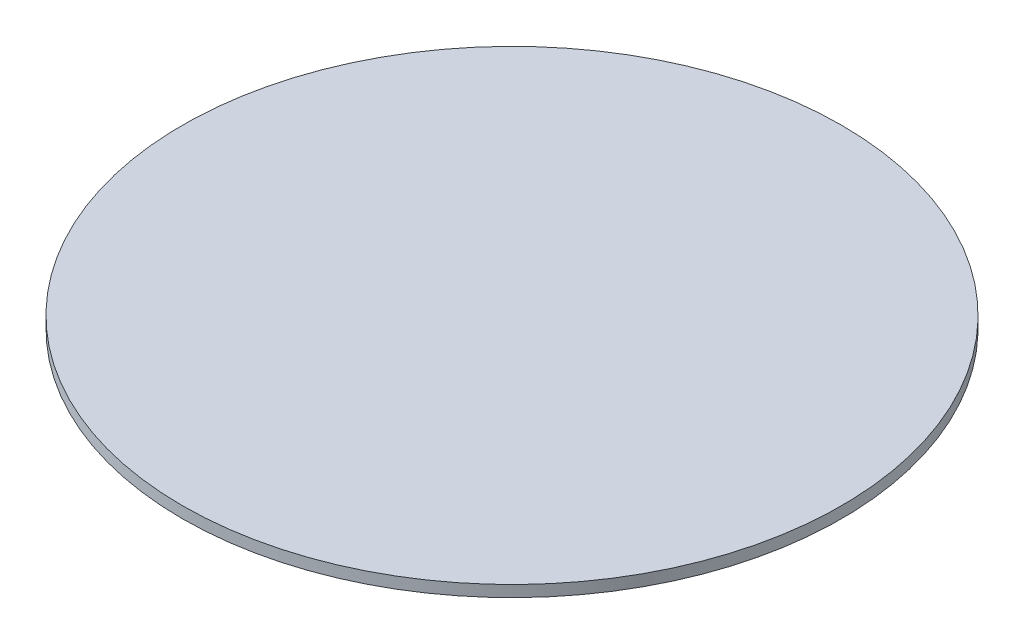
ISO-10303-21;
HEADER;
FILE_DESCRIPTION(('STEP AP214'),'2;1');
FILE_NAME('part.step','',(''),(''),'','','');
FILE_SCHEMA(('AUTOMOTIVE_DESIGN { 1 0 10303 214 1 1 1 1 }'));
ENDSEC;
DATA;
#1=APPLICATION_CONTEXT('core data for automotive mechanical design processes');
#2=APPLICATION_PROTOCOL_DEFINITION('international standard','automotive_design',2000,#1);
#3=PRODUCT_CONTEXT('',#1,'mechanical');
#4=PRODUCT('Part','Part','',(#3));
#5=PRODUCT_RELATED_PRODUCT_CATEGORY('part','',(#4));
#6=PRODUCT_DEFINITION_FORMATION('','',#4);
#7=PRODUCT_DEFINITION_CONTEXT('part definition',#1,'design');
#8=PRODUCT_DEFINITION('design','',#6,#7);
#9=PRODUCT_DEFINITION_SHAPE('','',#8);
#10=(LENGTH_UNIT() NAMED_UNIT(*) SI_UNIT(.MILLI.,.METRE.));
#11=(NAMED_UNIT(*) PLANE_ANGLE_UNIT() SI_UNIT($,.RADIAN.));
#12=(NAMED_UNIT(*) SI_UNIT($,.STERADIAN.) SOLID_ANGLE_UNIT());
#13=UNCERTAINTY_MEASURE_WITH_UNIT(LENGTH_MEASURE(1.E-05),#10,'distance_accuracy_value','');
#14=(GEOMETRIC_REPRESENTATION_CONTEXT(3) GLOBAL_UNCERTAINTY_ASSIGNED_CONTEXT((#13)) GLOBAL_UNIT_ASSIGNED_CONTEXT((#10,
#11,#12)) REPRESENTATION_CONTEXT('',''));
#15=CARTESIAN_POINT('',(0.,0.,0.));
#16=DIRECTION('',(0.,0.,1.));
#17=DIRECTION('',(1.,0.,0.));
#18=AXIS2_PLACEMENT_3D('',#15,#16,#17);
#19=CARTESIAN_POINT('',(0.,5.,0.));
#20=DIRECTION('',(0.,-1.,0.));
#21=DIRECTION('',(0.,0.,-1.));
#22=AXIS2_PLACEMENT_3D('',#19,#20,#21);
#23=CYLINDRICAL_SURFACE('',#22,145.);
#24=CARTESIAN_POINT('',(0.,5.,0.));
#25=DIRECTION('',(0.,1.,0.));
#26=DIRECTION('',(0.,0.,1.));
#27=AXIS2_PLACEMENT_3D('',#24,#25,#26);
#28=CIRCLE('',#27,145.);
#29=CARTESIAN_POINT('',(0.,5.,145.));
#30=VERTEX_POINT('',#29);
#31=EDGE_CURVE('E10',#30,#30,#28,.T.);
#32=ORIENTED_EDGE('',*,*,#31,.F.);
#33=EDGE_LOOP('',(#32));
#34=FACE_BOUND('',#33,.T.);
#35=CARTESIAN_POINT('',(0.,0.,0.));
#36=DIRECTION('',(0.,1.,0.));
#37=DIRECTION('',(0.,0.,1.));
#38=AXIS2_PLACEMENT_3D('',#35,#36,#37);
#39=CIRCLE('',#38,145.);
#40=CARTESIAN_POINT('',(0.,0.,145.));
#41=VERTEX_POINT('',#40);
#42=EDGE_CURVE('E39',#41,#41,#39,.T.);
#43=ORIENTED_EDGE('',*,*,#42,.T.);
#44=EDGE_LOOP('',(#43));
#45=FACE_BOUND('',#44,.T.);
#46=ADVANCED_FACE('F36',(#34,#45),#23,.T.);
#47=CARTESIAN_POINT('',(0.,5.,0.));
#48=DIRECTION('',(0.,1.,0.));
#49=DIRECTION('',(0.,0.,1.));
#50=AXIS2_PLACEMENT_3D('',#47,#48,#49);
#51=PLANE('',#50);
#52=ORIENTED_EDGE('',*,*,#31,.T.);
#53=EDGE_LOOP('',(#52));
#54=FACE_BOUND('',#53,.T.);
#55=ADVANCED_FACE('F53',(#54),#51,.T.);
#56=CARTESIAN_POINT('',(0.,0.,0.));
#57=DIRECTION('',(0.,1.,0.));
#58=DIRECTION('',(0.,0.,1.));
#59=AXIS2_PLACEMENT_3D('',#56,#57,#58);
#60=PLANE('',#59);
#61=ORIENTED_EDGE('',*,*,#42,.F.);
#62=EDGE_LOOP('',(#61));
#63=FACE_BOUND('',#62,.T.);
#64=ADVANCED_FACE('F51',(#63),#60,.F.);
#65=CLOSED_SHELL('',(#46,#55,#64));
#66=MANIFOLD_SOLID_BREP('B2',#65);
#67=ADVANCED_BREP_SHAPE_REPRESENTATION('',(#18,#66),#14);
#68=SHAPE_DEFINITION_REPRESENTATION(#9,#67);
ENDSEC;
END-ISO-10303-21;
